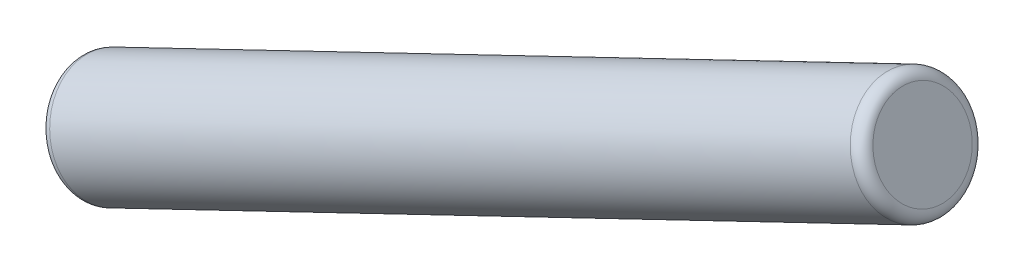
ISO-10303-21;
HEADER;
FILE_DESCRIPTION(('STEP AP214'),'2;1');
FILE_NAME('part.step','',(''),(''),'','','');
FILE_SCHEMA(('AUTOMOTIVE_DESIGN { 1 0 10303 214 1 1 1 1 }'));
ENDSEC;
DATA;
#1=APPLICATION_CONTEXT('core data for automotive mechanical design processes');
#2=APPLICATION_PROTOCOL_DEFINITION('international standard','automotive_design',2000,#1);
#3=PRODUCT_CONTEXT('',#1,'mechanical');
#4=PRODUCT('Part','Part','',(#3));
#5=PRODUCT_RELATED_PRODUCT_CATEGORY('part','',(#4));
#6=PRODUCT_DEFINITION_FORMATION('','',#4);
#7=PRODUCT_DEFINITION_CONTEXT('part definition',#1,'design');
#8=PRODUCT_DEFINITION('design','',#6,#7);
#9=PRODUCT_DEFINITION_SHAPE('','',#8);
#10=(LENGTH_UNIT() NAMED_UNIT(*) SI_UNIT(.MILLI.,.METRE.));
#11=(NAMED_UNIT(*) PLANE_ANGLE_UNIT() SI_UNIT($,.RADIAN.));
#12=(NAMED_UNIT(*) SI_UNIT($,.STERADIAN.) SOLID_ANGLE_UNIT());
#13=UNCERTAINTY_MEASURE_WITH_UNIT(LENGTH_MEASURE(1.E-05),#10,'distance_accuracy_value','');
#14=(GEOMETRIC_REPRESENTATION_CONTEXT(3) GLOBAL_UNCERTAINTY_ASSIGNED_CONTEXT((#13)) GLOBAL_UNIT_ASSIGNED_CONTEXT((#10,
#11,#12)) REPRESENTATION_CONTEXT('',''));
#15=CARTESIAN_POINT('',(0.,0.,0.));
#16=DIRECTION('',(0.,0.,1.));
#17=DIRECTION('',(1.,0.,0.));
#18=AXIS2_PLACEMENT_3D('',#15,#16,#17);
#19=CARTESIAN_POINT('',(19.4228984178456,-17.2844154384824,0.));
#20=DIRECTION('',(-0.900968867902419,-0.433883739117559,0.));
#21=DIRECTION('',(0.433883739117559,-0.900968867902419,0.));
#22=AXIS2_PLACEMENT_3D('',#19,#20,#21);
#23=PLANE('',#22);
#24=CARTESIAN_POINT('',(19.7875532489214,-18.0416289975749,0.541898957463119));
#25=CARTESIAN_POINT('',(19.7831567020404,-18.0324994739054,0.557615564688659));
#26=CARTESIAN_POINT('',(19.778568471355,-18.0229719147147,0.573047249775981));
#27=CARTESIAN_POINT('',(19.7690239918703,-18.0031525988455,0.60329375261766));
#28=CARTESIAN_POINT('',(19.7640677430709,-17.992860842167,0.618108570372018));
#29=CARTESIAN_POINT('',(19.7538025768532,-17.9715450048764,0.64707431549124));
#30=CARTESIAN_POINT('',(19.7484936594347,-17.9605209242644,0.661225242856104));
#31=CARTESIAN_POINT('',(19.7375399253636,-17.9377752610932,0.688818793045261));
#32=CARTESIAN_POINT('',(19.7318951087108,-17.9260536785341,0.702261415869553));
#33=CARTESIAN_POINT('',(19.7202873192842,-17.9019498554227,0.728396032064785));
#34=CARTESIAN_POINT('',(19.7143243465102,-17.8895676148705,0.741088025435725));
#35=CARTESIAN_POINT('',(19.702099011267,-17.8641814446577,0.765681456908111));
#36=CARTESIAN_POINT('',(19.6958366487978,-17.8511775149972,0.777582895009556));
#37=CARTESIAN_POINT('',(19.6830322366118,-17.8245888791225,0.800557767501303));
#38=CARTESIAN_POINT('',(19.676490186895,-17.8110041729082,0.811631201891604));
#39=CARTESIAN_POINT('',(19.6631469842607,-17.7832967271393,0.83291522640621));
#40=CARTESIAN_POINT('',(19.6563458313432,-17.7691739875847,0.843125816530516));
#41=CARTESIAN_POINT('',(19.6425058211601,-17.7404349103106,0.862652026067249));
#42=CARTESIAN_POINT('',(19.6354669638945,-17.7258185725912,0.871967645479677));
#43=CARTESIAN_POINT('',(19.6211736918885,-17.6961382874438,0.889674603248208));
#44=CARTESIAN_POINT('',(19.6139192771482,-17.6810743400159,0.898065941604313));
#45=CARTESIAN_POINT('',(19.5992177152589,-17.6505462321898,0.913897934994335));
#46=CARTESIAN_POINT('',(19.59177056811,-17.6350820717916,0.921338590028252));
#47=CARTESIAN_POINT('',(19.5767069728854,-17.6038021939985,0.93524580572331));
#48=CARTESIAN_POINT('',(19.5690905248098,-17.5879864766035,0.941712366384449));
#49=CARTESIAN_POINT('',(19.5537122918947,-17.5560532469139,0.953651047140923));
#50=CARTESIAN_POINT('',(19.5459505070553,-17.5399357346193,0.959123167236256));
#51=CARTESIAN_POINT('',(19.5303060220596,-17.5074496267874,0.96905574954705));
#52=CARTESIAN_POINT('',(19.5224233219033,-17.4910810312501,0.973516211762509));
#53=CARTESIAN_POINT('',(19.5065618081647,-17.4581442585898,0.981411444049038));
#54=CARTESIAN_POINT('',(19.4985829945824,-17.4415760814669,0.984846214120107));
#55=CARTESIAN_POINT('',(19.4825543582914,-17.4082922752508,0.990679255060927));
#56=CARTESIAN_POINT('',(19.4745045355828,-17.3915766461577,0.993077525930677));
#57=CARTESIAN_POINT('',(19.4583592087586,-17.3580505295527,0.996830022619771));
#58=CARTESIAN_POINT('',(19.4502637046431,-17.3412400420407,0.998184248439114));
#59=CARTESIAN_POINT('',(19.4340524864596,-17.3075771006183,0.99984439413812));
#60=CARTESIAN_POINT('',(19.4259367723917,-17.2907246467078,1.00015031401778));
#61=CARTESIAN_POINT('',(19.4097106693294,-17.2570307965159,0.999712885277289));
#62=CARTESIAN_POINT('',(19.401600280335,-17.2401894002345,0.998969536657135));
#63=CARTESIAN_POINT('',(19.3854103457529,-17.2065706546657,0.996435909852671));
#64=CARTESIAN_POINT('',(19.3773308001653,-17.1897933053784,0.994645631668363));
#65=CARTESIAN_POINT('',(19.3612279734536,-17.1563554411663,0.990023778292543));
#66=CARTESIAN_POINT('',(19.3532046923296,-17.1396949262415,0.987192203101032));
#67=CARTESIAN_POINT('',(19.3372396394378,-17.1065431523144,0.980496666090276));
#68=CARTESIAN_POINT('',(19.3292978676701,-17.090051893312,0.976632704271031));
#69=CARTESIAN_POINT('',(19.313520818698,-17.0572905135468,0.967884546993437));
#70=CARTESIAN_POINT('',(19.3056855414938,-17.041020392784,0.963000351535088));
#71=CARTESIAN_POINT('',(19.2901461438276,-17.0087525010403,0.952227111127968));
#72=CARTESIAN_POINT('',(19.2824420233657,-16.9927547300593,0.946338066179197));
#73=CARTESIAN_POINT('',(19.2671891437501,-16.9610817991785,0.933573593718993));
#74=CARTESIAN_POINT('',(19.2596403845965,-16.9454066392787,0.926698166207561));
#75=CARTESIAN_POINT('',(19.2447221110778,-16.9144285251166,0.911982793343399));
#76=CARTESIAN_POINT('',(19.2373525967127,-16.8991255708543,0.904142847990669));
#77=CARTESIAN_POINT('',(19.2228155062724,-16.8689389915133,0.887522240667872));
#78=CARTESIAN_POINT('',(19.2156479301971,-16.8540553664346,0.878741578697805));
#79=CARTESIAN_POINT('',(19.2050659686913,-16.8320816969437,0.864887738863119));
#80=CARTESIAN_POINT('',(19.2015667140587,-16.8248154198229,0.860155734965934));
#81=CARTESIAN_POINT('',(19.1946272164569,-16.8104054045836,0.850466811775349));
#82=CARTESIAN_POINT('',(19.1911869734877,-16.8032616664651,0.84550989248195));
#83=CARTESIAN_POINT('',(19.1835275835745,-16.7873567793752,0.834129316531308));
#84=CARTESIAN_POINT('',(19.1793253380598,-16.7786307265621,0.827645158209881));
#85=CARTESIAN_POINT('',(19.1710199928504,-16.7613845005783,0.814347987568411));
#86=CARTESIAN_POINT('',(19.1669168934407,-16.7528643279994,0.807534974303252));
#87=CARTESIAN_POINT('',(19.1588147866698,-16.7360401388674,0.793587285424667));
#88=CARTESIAN_POINT('',(19.1548157816001,-16.7277361270727,0.786452602739853));
#89=CARTESIAN_POINT('',(19.1469265631398,-16.7113540247333,0.771869752882305));
#90=CARTESIAN_POINT('',(19.1430363542285,-16.7032759434909,0.764421572833575));
#91=CARTESIAN_POINT('',(19.136327362504,-16.6893446423587,0.751121630106591));
#92=CARTESIAN_POINT('',(19.1334838134642,-16.6834399880375,0.745336158025022));
#93=CARTESIAN_POINT('',(19.1278632966109,-16.6717689445332,0.733595891088447));
#94=CARTESIAN_POINT('',(19.1250863325295,-16.6660025631004,0.727641086783008));
#95=CARTESIAN_POINT('',(19.1168508950983,-16.6489017471015,0.709541314336506));
#96=CARTESIAN_POINT('',(19.1114880033658,-16.6377659041498,0.697161239153804));
#97=CARTESIAN_POINT('',(19.1048320628221,-16.6239448634247,0.680864832684027));
#98=CARTESIAN_POINT('',(19.1033885648931,-16.6209474297001,0.677271705435691));
#99=CARTESIAN_POINT('',(19.0995071315748,-16.6128875455423,0.667446573914022));
#100=CARTESIAN_POINT('',(19.0970946072451,-16.6078778183672,0.661161122083232));
#101=CARTESIAN_POINT('',(19.0913499375605,-16.5959487219731,0.645805016447353));
#102=CARTESIAN_POINT('',(19.0880530869293,-16.5891026427241,0.636664252284008));
#103=CARTESIAN_POINT('',(19.0806575990356,-16.5737455304923,0.615387574996873));
#104=CARTESIAN_POINT('',(19.076608008072,-16.5653363438646,0.603160771009639));
#105=CARTESIAN_POINT('',(19.0696865171755,-16.5509635527868,0.581233544326243));
#106=CARTESIAN_POINT('',(19.0667626716374,-16.544892069841,0.571619838745147));
#107=CARTESIAN_POINT('',(19.0614464955414,-16.5338528440065,0.553478378300458));
#108=CARTESIAN_POINT('',(19.0590357146372,-16.5288467844751,0.544979329883086));
#109=CARTESIAN_POINT('',(19.0541128520756,-16.5186243274288,0.527041805421267));
#110=CARTESIAN_POINT('',(19.051611337931,-16.5134298751304,0.517587903231043));
#111=CARTESIAN_POINT('',(19.0473590259016,-16.5045998552373,0.500931287982885));
#112=CARTESIAN_POINT('',(19.0455791627079,-16.5009039315979,0.493767823453744));
#113=CARTESIAN_POINT('',(19.0416377530901,-16.4927195107645,0.477459965656197));
#114=CARTESIAN_POINT('',(19.0394980910874,-16.4882764569726,0.468287360416766));
#115=CARTESIAN_POINT('',(19.0353459397681,-16.4796544269332,0.449790376906029));
#116=CARTESIAN_POINT('',(19.0333334521463,-16.4754754542052,0.440465996614018));
#117=CARTESIAN_POINT('',(19.0294356700384,-16.4673816281316,0.421676976692625));
#118=CARTESIAN_POINT('',(19.0275503769648,-16.4634667777194,0.412212335506983));
#119=CARTESIAN_POINT('',(19.0239093642692,-16.4559061389492,0.393151457492217));
#120=CARTESIAN_POINT('',(19.0221536457983,-16.4522603529818,0.383555219494885));
#121=CARTESIAN_POINT('',(19.0187733687807,-16.4452411372586,0.364240742454758));
#122=CARTESIAN_POINT('',(19.0171488111078,-16.4418677093176,0.354522502599603));
#123=CARTESIAN_POINT('',(19.0140324913063,-16.4353966059408,0.334973522392924));
#124=CARTESIAN_POINT('',(19.0125407297677,-16.4322989317299,0.325142781541932));
#125=CARTESIAN_POINT('',(19.0096914585202,-16.4263823597508,0.305378468648902));
#126=CARTESIAN_POINT('',(19.0083339491095,-16.4235634626019,0.295444896378556));
#127=CARTESIAN_POINT('',(19.0057545204823,-16.4182072238665,0.275484675703196));
#128=CARTESIAN_POINT('',(19.0045326012658,-16.4156698822801,0.265458027298183));
#129=CARTESIAN_POINT('',(19.0022255475705,-16.410879235188,0.245321506955373));
#130=CARTESIAN_POINT('',(19.001140412788,-16.4086259290515,0.235211635202439));
#131=CARTESIAN_POINT('',(18.9991080129282,-16.404405605886,0.214918596114457));
#132=CARTESIAN_POINT('',(18.9981607472386,-16.4024385875855,0.204735429105142));
#133=CARTESIAN_POINT('',(18.9964049427375,-16.3987926201438,0.18430582122218));
#134=CARTESIAN_POINT('',(18.9955964030019,-16.3971136690835,0.174059380770521));
#135=CARTESIAN_POINT('',(18.9941191120791,-16.3940460408636,0.153513230947673));
#136=CARTESIAN_POINT('',(18.9934503596502,-16.3926573611256,0.143213522050473));
#137=CARTESIAN_POINT('',(18.9922522930557,-16.3901695483802,0.122571187750344));
#138=CARTESIAN_POINT('',(18.9917229773419,-16.3890704121579,0.112228562825214));
#139=CARTESIAN_POINT('',(18.9908080506658,-16.3871705461527,0.0915096900765554));
#140=CARTESIAN_POINT('',(18.9904224377889,-16.3863698123937,0.0811334427028725));
#141=CARTESIAN_POINT('',(18.9898881611879,-16.3852603755958,0.0638230839152958));
#142=CARTESIAN_POINT('',(18.9897033609557,-16.3848766341207,0.0568946254430263));
#143=CARTESIAN_POINT('',(18.9891813006668,-16.3837925679802,0.0333232878513868));
#144=CARTESIAN_POINT('',(18.9889928345969,-16.3834012209527,0.0166607755908356));
#145=CARTESIAN_POINT('',(18.9889806824609,-16.3833760044291,-0.00944100804800048));
#146=CARTESIAN_POINT('',(18.9890343136132,-16.383487378481,-0.0188814584436563));
#147=CARTESIAN_POINT('',(18.9893255113405,-16.3840920787103,-0.0434357301501631));
#148=CARTESIAN_POINT('',(18.9896543528159,-16.3847749401226,-0.0585445257917403));
#149=CARTESIAN_POINT('',(18.9906101863256,-16.3867597791976,-0.088711827654983));
#150=CARTESIAN_POINT('',(18.9912371888844,-16.3880617787147,-0.103770332082563));
#151=CARTESIAN_POINT('',(18.9927881400075,-16.3912823900686,-0.133806470149006));
#152=CARTESIAN_POINT('',(18.9937120964533,-16.3932010182713,-0.148784101630672));
#153=CARTESIAN_POINT('',(18.9958550246145,-16.3976508759739,-0.178627061347848));
#154=CARTESIAN_POINT('',(18.9970740015769,-16.4001821163692,-0.193492387581105));
#155=CARTESIAN_POINT('',(18.9998044470114,-16.4058519566862,-0.223079811762353));
#156=CARTESIAN_POINT('',(19.0013159181249,-16.4089905620925,-0.237801908415677));
#157=CARTESIAN_POINT('',(19.0046282057429,-16.4158685990418,-0.267072175235392));
#158=CARTESIAN_POINT('',(19.006429022327,-16.41960803075,-0.281620345353956));
#159=CARTESIAN_POINT('',(19.0103162485789,-16.4276799288596,-0.310512445207043));
#160=CARTESIAN_POINT('',(19.0124026558245,-16.4320123902313,-0.324856376672616));
#161=CARTESIAN_POINT('',(19.0168567094265,-16.4412613075683,-0.353310110237564));
#162=CARTESIAN_POINT('',(19.0192243509347,-16.4461777534662,-0.36741991636824));
#163=CARTESIAN_POINT('',(19.024235930812,-16.4565843788952,-0.395376000503457));
#164=CARTESIAN_POINT('',(19.0268798619978,-16.46207454351,-0.409222285348251));
#165=CARTESIAN_POINT('',(19.0324384879633,-16.4736171188799,-0.436622496257083));
#166=CARTESIAN_POINT('',(19.035353173331,-16.4796695100906,-0.450176432463683));
#167=CARTESIAN_POINT('',(19.0414472438462,-16.4923239501291,-0.476963680121148));
#168=CARTESIAN_POINT('',(19.0446266174721,-16.4989259750315,-0.490197005495755));
#169=CARTESIAN_POINT('',(19.0512433013426,-16.5126656426252,-0.516315632296507));
#170=CARTESIAN_POINT('',(19.0546805980973,-16.5198032573042,-0.529200951876161));
#171=CARTESIAN_POINT('',(19.0582435867698,-16.52720187939,-0.5418989574631));
#172=B_SPLINE_CURVE_WITH_KNOTS('',3,(#24,#25,#26,#27,#28,#29,#30,#31,#32,#33,#34,#35,#36,#37,
#38,#39,#40,#41,#42,#43,#44,#45,#46,#47,#48,#49,#50,#51,#52,#53,#54,#55,#56,#57,#58,#59,#60,#61,
#62,#63,#64,#65,#66,#67,#68,#69,#70,#71,#72,#73,#74,#75,#76,#77,#78,#79,#80,#81,#82,#83,#84,#85,
#86,#87,#88,#89,#90,#91,#92,#93,#94,#95,#96,#97,#98,#99,#100,#101,#102,#103,#104,#105,#106,#107,
#108,#109,#110,#111,#112,#113,#114,#115,#116,#117,#118,#119,#120,#121,#122,#123,#124,#125,#126,
#127,#128,#129,#130,#131,#132,#133,#134,#135,#136,#137,#138,#139,#140,#141,#142,#143,#144,#145,
#146,#147,#148,#149,#150,#151,#152,#153,#154,#155,#156,#157,#158,#159,#160,#161,#162,#163,#164,
#165,#166,#167,#168,#169,#170,#171),.UNSPECIFIED.,.F.,.F.,(4,2,2,2,2,2,2,2,2,2,2,2,2,2,2,2,2,2,
2,2,2,2,2,2,2,2,2,2,2,2,2,2,2,2,2,2,2,2,2,2,2,2,2,2,2,2,2,2,2,2,2,2,2,2,2,2,2,2,2,2,2,2,2,2,2,2,
2,2,2,2,2,2,2,4),(0.,0.0560925125517366,0.112185025103475,0.168277537655212,0.224370050206951,
0.280462562758688,0.336555075310424,0.392647587862164,0.448740100413901,0.504832612965637,
0.560925125517376,0.617017638069113,0.673110150620848,0.729202663172587,0.785295175724326,
0.841387688276063,0.897480200827798,0.953572713379536,1.00966522593127,1.06575773848301,
1.12185025103475,1.17794276358649,1.23403527613822,1.29012778868996,1.3462203012417,
1.40231281379344,1.45840532634517,1.51449783889691,1.54254685374404,1.57059586859116,
1.6055548148505,1.64051386158647,1.67547367721621,1.71043493012285,1.73665778139983,
1.76288209905799,1.81533189201038,1.83002193099482,1.85519445725844,1.89084697100547,
1.93697520452348,1.97218938730277,2.00264732373157,2.03586082440905,2.06062350570099,
2.09186088572547,2.12309868197913,2.15433682509048,2.18557524568797,2.21681387440009,
2.2480526418553,2.27929147868204,2.31053031550879,2.34176908296399,2.37300771167611,
2.40424613227361,2.43548427538495,2.46672207163862,2.49795945166309,2.51878333615692,
2.56876232978396,2.59708346516519,2.64244963457581,2.68781740544908,2.73318638053787,
2.77855616259525,2.82392635437465,2.86929655862983,2.91466637811505,2.96003541558502,
3.00540327379502,3.05076955550099,3.09613386345958,3.14149580042834),.UNSPECIFIED.);
#173=CARTESIAN_POINT('',(19.7875532489214,-18.0416289975749,0.54189895746312));
#174=VERTEX_POINT('',#173);
#175=CARTESIAN_POINT('',(19.0582435867698,-16.52720187939,-0.541898957463101));
#176=VERTEX_POINT('',#175);
#177=EDGE_CURVE('E47',#174,#176,#172,.T.);
#178=ORIENTED_EDGE('',*,*,#177,.F.);
#179=CARTESIAN_POINT('',(19.4228984178456,-17.2844154384824,0.));
#180=DIRECTION('',(0.900968867902419,0.433883739117558,0.));
#181=DIRECTION('',(-0.433883739117558,0.900968867902419,0.));
#182=AXIS2_PLACEMENT_3D('',#179,#180,#181);
#183=CIRCLE('',#182,0.999999999999995);
#184=EDGE_CURVE('E21',#176,#174,#183,.F.);
#185=ORIENTED_EDGE('',*,*,#184,.F.);
#186=EDGE_LOOP('',(#178,#185));
#187=FACE_BOUND('',#186,.T.);
#188=ADVANCED_FACE('F17',(#187),#23,.F.);
#189=CARTESIAN_POINT('',(1.40352105979721,-25.9620902208336,0.));
#190=DIRECTION('',(-0.900968867902419,-0.433883739117559,0.));
#191=DIRECTION('',(0.433883739117559,-0.900968867902419,0.));
#192=AXIS2_PLACEMENT_3D('',#189,#190,#191);
#193=PLANE('',#192);
#194=CARTESIAN_POINT('',(1.76817589087306,-26.719303779926,0.541898957463097));
#195=CARTESIAN_POINT('',(1.77128649488755,-26.7257630157177,0.530780335937413));
#196=CARTESIAN_POINT('',(1.7743012966464,-26.732023316077,0.51951935854342));
#197=CARTESIAN_POINT('',(1.78013479670152,-26.7441367037575,0.496730737371689));
#198=CARTESIAN_POINT('',(1.78295349487544,-26.7499897908245,0.485203093427569));
#199=CARTESIAN_POINT('',(1.78839028839428,-26.7612794088844,0.461899183521548));
#200=CARTESIAN_POINT('',(1.79100838348255,-26.7667159393445,0.450122917241591));
#201=CARTESIAN_POINT('',(1.79603986959163,-26.7771639278709,0.426340309103476));
#202=CARTESIAN_POINT('',(1.79845326021638,-26.782175385115,0.414333966800225));
#203=CARTESIAN_POINT('',(1.80307153526242,-26.7917653319789,0.390110089322898));
#204=CARTESIAN_POINT('',(1.80527641914363,-26.7963438204773,0.377892553601887));
#205=CARTESIAN_POINT('',(1.80947421392039,-26.8050606309848,0.353265494271628));
#206=CARTESIAN_POINT('',(1.81146712412795,-26.8091989515653,0.340855970039411));
#207=CARTESIAN_POINT('',(1.81523782992356,-26.8170289025452,0.315864504829754));
#208=CARTESIAN_POINT('',(1.81701562467243,-26.820720531202,0.303282563179924));
#209=CARTESIAN_POINT('',(1.82035332032573,-26.827651327189,0.277965857871566));
#210=CARTESIAN_POINT('',(1.82191322023734,-26.8308904924574,0.265231093517002));
#211=CARTESIAN_POINT('',(1.82452806750851,-26.8363202781558,0.242141933025877));
#212=CARTESIAN_POINT('',(1.8256220319361,-26.8385919183846,0.231810900743125));
#213=CARTESIAN_POINT('',(1.82766652292276,-26.8428373469402,0.211073562430965));
#214=CARTESIAN_POINT('',(1.82861704882029,-26.8448111338933,0.200667256054616));
#215=CARTESIAN_POINT('',(1.83037367887383,-26.8484588128453,0.179790066862294));
#216=CARTESIAN_POINT('',(1.8311797823026,-26.8501327033341,0.169319183721424));
#217=CARTESIAN_POINT('',(1.83264675140613,-26.8531788948695,0.148323447012241));
#218=CARTESIAN_POINT('',(1.83330761628806,-26.8545511942697,0.137798593149636));
#219=CARTESIAN_POINT('',(1.83448343370489,-26.8569928027992,0.116705618299806));
#220=CARTESIAN_POINT('',(1.83499838538152,-26.8580621101463,0.106137497058452));
#221=CARTESIAN_POINT('',(1.83588185282573,-26.8598966473564,0.084968722205033));
#222=CARTESIAN_POINT('',(1.83625036766996,-26.8606618753021,0.0743680683882652));
#223=CARTESIAN_POINT('',(1.83684058101921,-26.8618874637184,0.0531450042829465));
#224=CARTESIAN_POINT('',(1.83706227853635,-26.8623478221377,0.042522593848487));
#225=CARTESIAN_POINT('',(1.83735864512302,-26.8629632310043,0.0212667952696037));
#226=CARTESIAN_POINT('',(1.83743331314102,-26.8631182792681,0.010633407047213));
#227=CARTESIAN_POINT('',(1.83743545571316,-26.8631227252623,-0.0103333653711664));
#228=CARTESIAN_POINT('',(1.83736702415892,-26.8629806240519,-0.0206667485197868));
#229=CARTESIAN_POINT('',(1.83709119704815,-26.8624078598112,-0.0413237439238014));
#230=CARTESIAN_POINT('',(1.8368838004938,-26.861977194709,-0.0516473561085033));
#231=CARTESIAN_POINT('',(1.83633025544847,-26.860827743035,-0.0722748706625234));
#232=CARTESIAN_POINT('',(1.83598410598867,-26.8601089544515,-0.0825787728937159));
#233=CARTESIAN_POINT('',(1.83515338204088,-26.8583839346657,-0.103156964978776));
#234=CARTESIAN_POINT('',(1.83466880661377,-26.8573777015133,-0.113431254631267));
#235=CARTESIAN_POINT('',(1.83356169576623,-26.8550787582551,-0.133940342638387));
#236=CARTESIAN_POINT('',(1.83293915943716,-26.8537860462626,-0.144175140732465));
#237=CARTESIAN_POINT('',(1.83155672317889,-26.8509153837598,-0.164595405809692));
#238=CARTESIAN_POINT('',(1.8307968223722,-26.8493374314274,-0.174780872477278));
#239=CARTESIAN_POINT('',(1.8291403860315,-26.8458978017761,-0.195092681869964));
#240=CARTESIAN_POINT('',(1.8282438496517,-26.844036122701,-0.205219024228677));
#241=CARTESIAN_POINT('',(1.82631500236681,-26.8400308258033,-0.225402848992768));
#242=CARTESIAN_POINT('',(1.82528269064815,-26.8378872062914,-0.235460330985152));
#243=CARTESIAN_POINT('',(1.82308328350043,-26.8333200859794,-0.255496765124641));
#244=CARTESIAN_POINT('',(1.82191618729044,-26.8308965835576,-0.265475716816383));
#245=CARTESIAN_POINT('',(1.81944833164812,-26.8257720241536,-0.285345495751623));
#246=CARTESIAN_POINT('',(1.81814757146781,-26.8230709656182,-0.29523632250164));
#247=CARTESIAN_POINT('',(1.81541363681169,-26.8173938874203,-0.314920342081977));
#248=CARTESIAN_POINT('',(1.81398046162111,-26.8144178662736,-0.324713534384956));
#249=CARTESIAN_POINT('',(1.81098307372892,-26.8081937217852,-0.34419286757726));
#250=CARTESIAN_POINT('',(1.80941886034593,-26.8049455970286,-0.353879007909624));
#251=CARTESIAN_POINT('',(1.80616089706895,-26.7981803621885,-0.373134929315907));
#252=CARTESIAN_POINT('',(1.80446714652703,-26.7946632507594,-0.382704709807521));
#253=CARTESIAN_POINT('',(1.80095174136109,-26.7873634323569,-0.40171869016083));
#254=CARTESIAN_POINT('',(1.79913008612261,-26.7835807241075,-0.411162889418979));
#255=CARTESIAN_POINT('',(1.79536060154548,-26.7757533044173,-0.42991670120338));
#256=CARTESIAN_POINT('',(1.79341277162567,-26.7717085917696,-0.439226313109487));
#257=CARTESIAN_POINT('',(1.78939288412768,-26.7633612051193,-0.457701720464067));
#258=CARTESIAN_POINT('',(1.78732082600192,-26.7590585299795,-0.466867515278375));
#259=CARTESIAN_POINT('',(1.78162120137128,-26.747223131911,-0.491153450752383));
#260=CARTESIAN_POINT('',(1.77788370465397,-26.7394621365827,-0.506137529726414));
#261=CARTESIAN_POINT('',(1.77007701706816,-26.7232513760804,-0.535638726408995));
#262=CARTESIAN_POINT('',(1.76600782404861,-26.7148016064396,-0.550155841088407));
#263=CARTESIAN_POINT('',(1.75754849615042,-26.6972356247082,-0.578684919203482));
#264=CARTESIAN_POINT('',(1.75315835936804,-26.6881194086646,-0.592696879641978));
#265=CARTESIAN_POINT('',(1.74406898237478,-26.6692451169108,-0.620177777592299));
#266=CARTESIAN_POINT('',(1.73936974050142,-26.6594870377486,-0.633646712182886));
#267=CARTESIAN_POINT('',(1.72967476286725,-26.6393552037657,-0.660005424257028));
#268=CARTESIAN_POINT('',(1.72467902567584,-26.6289814459743,-0.672895198945551));
#269=CARTESIAN_POINT('',(1.71440448004567,-26.6076461271557,-0.698060938728943));
#270=CARTESIAN_POINT('',(1.70912567039769,-26.5966845636174,-0.71033690120129));
#271=CARTESIAN_POINT('',(1.6982991591753,-26.5742030769887,-0.734242033537231));
#272=CARTESIAN_POINT('',(1.69275145660101,-26.562683151822,-0.745871200995352));
#273=CARTESIAN_POINT('',(1.68140206285577,-26.5391158890371,-0.768451493119576));
#274=CARTESIAN_POINT('',(1.67560037088088,-26.5270685497495,-0.779402615639222));
#275=CARTESIAN_POINT('',(1.66375858414478,-26.5024788230063,-0.800597391369441));
#276=CARTESIAN_POINT('',(1.65771848876086,-26.4899364342577,-0.810841042731907));
#277=CARTESIAN_POINT('',(1.64541612198429,-26.4643903038552,-0.830593350615667));
#278=CARTESIAN_POINT('',(1.63915385013424,-26.4513865612515,-0.840102005623668));
#279=CARTESIAN_POINT('',(1.62642395443641,-26.4249526585668,-0.858358770764088));
#280=CARTESIAN_POINT('',(1.61995633027948,-26.4115224978439,-0.86710687975145));
#281=CARTESIAN_POINT('',(1.60683310600456,-26.384271840639,-0.883819046894606));
#282=CARTESIAN_POINT('',(1.60017750570759,-26.3704513437854,-0.891783104303792));
#283=CARTESIAN_POINT('',(1.58669621048646,-26.342457145295,-0.906905769661076));
#284=CARTESIAN_POINT('',(1.57987051549446,-26.3282834435173,-0.914064377287858));
#285=CARTESIAN_POINT('',(1.56606736943601,-26.2996209155765,-0.927556909312355));
#286=CARTESIAN_POINT('',(1.55908991839299,-26.2851320894621,-0.933890833837385));
#287=CARTESIAN_POINT('',(1.5450020066932,-26.2558782402724,-0.945716982475469));
#288=CARTESIAN_POINT('',(1.53789154613055,-26.2411132173926,-0.95120920718418));
#289=CARTESIAN_POINT('',(1.52355671935253,-26.211346644451,-0.961337201349508));
#290=CARTESIAN_POINT('',(1.51633235328082,-26.1963450946875,-0.965972971886099));
#291=CARTESIAN_POINT('',(1.50178912557672,-26.1661457734422,-0.97437560488265));
#292=CARTESIAN_POINT('',(1.49447026411581,-26.1509480023164,-0.978142468919057));
#293=CARTESIAN_POINT('',(1.47975770966359,-26.1203970711153,-0.984797171586322));
#294=CARTESIAN_POINT('',(1.47236401684948,-26.1050439114081,-0.987685012298352));
#295=CARTESIAN_POINT('',(1.45752166478361,-26.0742234533209,-0.992573913681045));
#296=CARTESIAN_POINT('',(1.45007300569245,-26.0587561552744,-0.994574976941905));
#297=CARTESIAN_POINT('',(1.43514073381124,-26.0277489773725,-0.997684952321212));
#298=CARTESIAN_POINT('',(1.42765712114272,-26.0122090977696,-0.99879386753919));
#299=CARTESIAN_POINT('',(1.41267504867829,-25.9810985084616,-1.00011657369628));
#300=CARTESIAN_POINT('',(1.40517658894231,-25.9655277988811,-1.00033036824055));
#301=CARTESIAN_POINT('',(1.39018496868176,-25.9343973838997,-0.999862265857531));
#302=CARTESIAN_POINT('',(1.38269180813308,-25.9188376784487,-0.99918037303332));
#303=CARTESIAN_POINT('',(1.36773091818125,-25.8877710760935,-0.996922736171513));
#304=CARTESIAN_POINT('',(1.36026318864771,-25.8722641789186,-0.995346996723187));
#305=CARTESIAN_POINT('',(1.34537322412272,-25.8413448551602,-0.991305909353181));
#306=CARTESIAN_POINT('',(1.33795098887274,-25.8259324280399,-0.988840566491284));
#307=CARTESIAN_POINT('',(1.32317195382587,-25.7952434520886,-0.983026906084368));
#308=CARTESIAN_POINT('',(1.3158151536209,-25.7799669024103,-0.979678594050046));
#309=CARTESIAN_POINT('',(1.30118675347163,-25.7495907233556,-0.972108002275223));
#310=CARTESIAN_POINT('',(1.2939151529488,-25.7344910927779,-0.967885728472889));
#311=CARTESIAN_POINT('',(1.27947668772438,-25.7045093178979,-0.958578569078487));
#312=CARTESIAN_POINT('',(1.27230982225362,-25.6896271719985,-0.953493689824854));
#313=CARTESIAN_POINT('',(1.25810008092059,-25.6601203473372,-0.942474993818317));
#314=CARTESIAN_POINT('',(1.25105720407912,-25.6454956665421,-0.936541183773256));
#315=CARTESIAN_POINT('',(1.23711436025116,-25.6165430603446,-0.92384058204651));
#316=CARTESIAN_POINT('',(1.23021439205696,-25.6022151324343,-0.917073797407681));
#317=CARTESIAN_POINT('',(1.21657590135919,-25.5738945220211,-0.902725440990665));
#318=CARTESIAN_POINT('',(1.2098373774019,-25.5599018364996,-0.89514387655255));
#319=CARTESIAN_POINT('',(1.19653987677008,-25.5322892991599,-0.879186344705687));
#320=CARTESIAN_POINT('',(1.18998089837946,-25.5186694437783,-0.870810384893183));
#321=CARTESIAN_POINT('',(1.17706010755617,-25.4918391522243,-0.853286581301291));
#322=CARTESIAN_POINT('',(1.17069829312989,-25.4786287119121,-0.844138745330195));
#323=CARTESIAN_POINT('',(1.15818891865626,-25.4526527349159,-0.825095782621606));
#324=CARTESIAN_POINT('',(1.15204135632391,-25.4398871934869,-0.815200663857433));
#325=CARTESIAN_POINT('',(1.13997699815998,-25.4148353019754,-0.794689736967533));
#326=CARTESIAN_POINT('',(1.13406019973957,-25.4025489465171,-0.784073936930427));
#327=CARTESIAN_POINT('',(1.1224732612318,-25.3784884266181,-0.762150184873559));
#328=CARTESIAN_POINT('',(1.11680311824081,-25.366714256148,-0.750842241005512));
#329=CARTESIAN_POINT('',(1.10572471793526,-25.343709726068,-0.727564600327484));
#330=CARTESIAN_POINT('',(1.10031645739283,-25.3324793597556,-0.715594911677801));
#331=CARTESIAN_POINT('',(1.08977634943865,-25.3105926044962,-0.691025951160806));
#332=CARTESIAN_POINT('',(1.08464449846695,-25.2999362081571,-0.678426687405944));
#333=CARTESIAN_POINT('',(1.07467097753867,-25.2792259820839,-0.652632464861409));
#334=CARTESIAN_POINT('',(1.06982930368419,-25.2691721442559,-0.639437514077669));
#335=CARTESIAN_POINT('',(1.0604491853124,-25.2496941302549,-0.612487304876377));
#336=CARTESIAN_POINT('',(1.05591073655404,-25.2402699452754,-0.598732054299782));
#337=CARTESIAN_POINT('',(1.04714907467387,-25.2220761682358,-0.570698514914157));
#338=CARTESIAN_POINT('',(1.04292585696852,-25.213306566658,-0.55642023371459));
#339=CARTESIAN_POINT('',(1.03886622872138,-25.2048766617411,-0.541898957463122));
#340=B_SPLINE_CURVE_WITH_KNOTS('',3,(#194,#195,#196,#197,#198,#199,#200,#201,#202,#203,#204,
#205,#206,#207,#208,#209,#210,#211,#212,#213,#214,#215,#216,#217,#218,#219,#220,#221,#222,#223,
#224,#225,#226,#227,#228,#229,#230,#231,#232,#233,#234,#235,#236,#237,#238,#239,#240,#241,#242,
#243,#244,#245,#246,#247,#248,#249,#250,#251,#252,#253,#254,#255,#256,#257,#258,#259,#260,#261,
#262,#263,#264,#265,#266,#267,#268,#269,#270,#271,#272,#273,#274,#275,#276,#277,#278,#279,#280,
#281,#282,#283,#284,#285,#286,#287,#288,#289,#290,#291,#292,#293,#294,#295,#296,#297,#298,#299,
#300,#301,#302,#303,#304,#305,#306,#307,#308,#309,#310,#311,#312,#313,#314,#315,#316,#317,#318,
#319,#320,#321,#322,#323,#324,#325,#326,#327,#328,#329,#330,#331,#332,#333,#334,#335,#336,#337,
#338,#339),.UNSPECIFIED.,.F.,.F.,(4,2,2,2,2,2,2,2,2,2,2,2,2,2,2,2,2,2,2,2,2,2,2,2,2,2,2,2,2,2,2,
2,2,2,2,2,2,2,2,2,2,2,2,2,2,2,2,2,2,2,2,2,2,2,2,2,2,2,2,2,2,2,2,2,2,2,2,2,2,2,2,2,4),(0.,
0.0396860684620307,0.0793721616861029,0.119058305682335,0.158744526460844,0.198430850031744,
0.238117302405147,0.27780390959116,0.317490697599891,0.349388292485285,0.381286034481343,
0.413183937091733,0.44508201382012,0.476980278170169,0.508878743645543,0.540777423749903,
0.57267633198691,0.603675152241797,0.634674195082687,0.665673454372222,0.696672923973044,
0.727672597747794,0.758672469559116,0.789672533269651,0.820672782742041,0.851673211838929,
0.882673814422958,0.913674584356769,0.944675515503007,0.975676601724313,1.00667783688333,
1.0376792148427,1.06868072946507,1.12050676256721,1.17233313179046,1.22415980845795,
1.27598676389281,1.32781396941817,1.37964139635718,1.43146901603297,1.48329679976868,
1.53512471888746,1.58695274471243,1.63878084856675,1.69060900177356,1.74243717565599,
1.7942653415372,1.84609347074033,1.89792153458852,1.94974950440492,2.00157735151268,
2.05340504723492,2.10523256289481,2.15705986981548,2.20888693932008,2.26071374273175,
2.31254025137364,2.36436643656888,2.4161922696406,2.46801772191197,2.51984276470611,
2.57166736934616,2.62349150715527,2.67531514945656,2.72713826757319,2.77896083282828,
2.83078281654497,2.88260419004641,2.93442492465573,2.98624499169608,3.0380643624906,
3.08988300836242,3.14170090063471),.UNSPECIFIED.);
#341=CARTESIAN_POINT('',(1.76817589087306,-26.719303779926,0.541898957463099));
#342=VERTEX_POINT('',#341);
#343=CARTESIAN_POINT('',(1.03886622872138,-25.2048766617411,-0.541898957463121));
#344=VERTEX_POINT('',#343);
#345=EDGE_CURVE('E35',#342,#344,#340,.T.);
#346=ORIENTED_EDGE('',*,*,#345,.F.);
#347=CARTESIAN_POINT('',(1.40352105979722,-25.9620902208336,0.));
#348=DIRECTION('',(-0.900968867902418,-0.43388373911756,0.));
#349=DIRECTION('',(0.43388373911756,-0.900968867902418,0.));
#350=AXIS2_PLACEMENT_3D('',#347,#348,#349);
#351=CIRCLE('',#350,1.);
#352=EDGE_CURVE('E48',#344,#342,#351,.F.);
#353=ORIENTED_EDGE('',*,*,#352,.F.);
#354=EDGE_LOOP('',(#346,#353));
#355=FACE_BOUND('',#354,.T.);
#356=ADVANCED_FACE('F62',(#355),#193,.T.);
#357=CARTESIAN_POINT('',(19.19765620087,-17.3928863732618,0.));
#358=DIRECTION('',(0.900968867902419,0.433883739117559,0.));
#359=DIRECTION('',(-0.433883739117559,0.900968867902419,0.));
#360=AXIS2_PLACEMENT_3D('',#357,#358,#359);
#361=TOROIDAL_SURFACE('',#360,0.999999999999997,0.25);
#362=ORIENTED_EDGE('',*,*,#184,.T.);
#363=ORIENTED_EDGE('',*,*,#177,.T.);
#364=EDGE_LOOP('',(#362,#363));
#365=FACE_BOUND('',#364,.T.);
#366=CARTESIAN_POINT('',(19.19765620087,-17.3928863732618,0.));
#367=DIRECTION('',(-0.900968867902419,-0.433883739117559,0.));
#368=DIRECTION('',(0.433883739117559,-0.900968867902419,0.));
#369=AXIS2_PLACEMENT_3D('',#366,#367,#368);
#370=CIRCLE('',#369,1.25);
#371=CARTESIAN_POINT('',(19.7400108747669,-18.5190974581398,0.));
#372=VERTEX_POINT('',#371);
#373=EDGE_CURVE('E27',#372,#372,#370,.T.);
#374=ORIENTED_EDGE('',*,*,#373,.F.);
#375=EDGE_LOOP('',(#374));
#376=FACE_BOUND('',#375,.T.);
#377=ADVANCED_FACE('F45',(#365,#376),#361,.T.);
#378=CARTESIAN_POINT('',(1.62876327677282,-25.8536192860542,0.));
#379=DIRECTION('',(-0.900968867902418,-0.43388373911756,0.));
#380=DIRECTION('',(0.43388373911756,-0.900968867902418,0.));
#381=AXIS2_PLACEMENT_3D('',#378,#379,#380);
#382=TOROIDAL_SURFACE('',#381,1.,0.250000000000003);
#383=ORIENTED_EDGE('',*,*,#345,.T.);
#384=ORIENTED_EDGE('',*,*,#352,.T.);
#385=EDGE_LOOP('',(#383,#384));
#386=FACE_BOUND('',#385,.T.);
#387=CARTESIAN_POINT('',(1.62876327677281,-25.8536192860542,0.));
#388=DIRECTION('',(-0.900968867902419,-0.433883739117559,0.));
#389=DIRECTION('',(0.433883739117559,-0.900968867902419,0.));
#390=AXIS2_PLACEMENT_3D('',#387,#388,#389);
#391=CIRCLE('',#390,1.25);
#392=CARTESIAN_POINT('',(2.17111795066976,-26.9798303709322,0.));
#393=VERTEX_POINT('',#392);
#394=EDGE_CURVE('E11',#393,#393,#391,.F.);
#395=ORIENTED_EDGE('',*,*,#394,.F.);
#396=EDGE_LOOP('',(#395));
#397=FACE_BOUND('',#396,.T.);
#398=ADVANCED_FACE('F19',(#386,#397),#382,.T.);
#399=CARTESIAN_POINT('',(10.4132097388214,-21.623252829658,0.));
#400=DIRECTION('',(-0.900968867902419,-0.433883739117559,0.));
#401=DIRECTION('',(0.433883739117559,-0.900968867902419,0.));
#402=AXIS2_PLACEMENT_3D('',#399,#400,#401);
#403=CYLINDRICAL_SURFACE('',#402,1.25);
#404=ORIENTED_EDGE('',*,*,#394,.T.);
#405=EDGE_LOOP('',(#404));
#406=FACE_BOUND('',#405,.T.);
#407=ORIENTED_EDGE('',*,*,#373,.T.);
#408=EDGE_LOOP('',(#407));
#409=FACE_BOUND('',#408,.T.);
#410=ADVANCED_FACE('F69',(#406,#409),#403,.T.);
#411=CLOSED_SHELL('',(#188,#356,#377,#398,#410));
#412=MANIFOLD_SOLID_BREP('B1',#411);
#413=ADVANCED_BREP_SHAPE_REPRESENTATION('',(#18,#412),#14);
#414=SHAPE_DEFINITION_REPRESENTATION(#9,#413);
ENDSEC;
END-ISO-10303-21;
